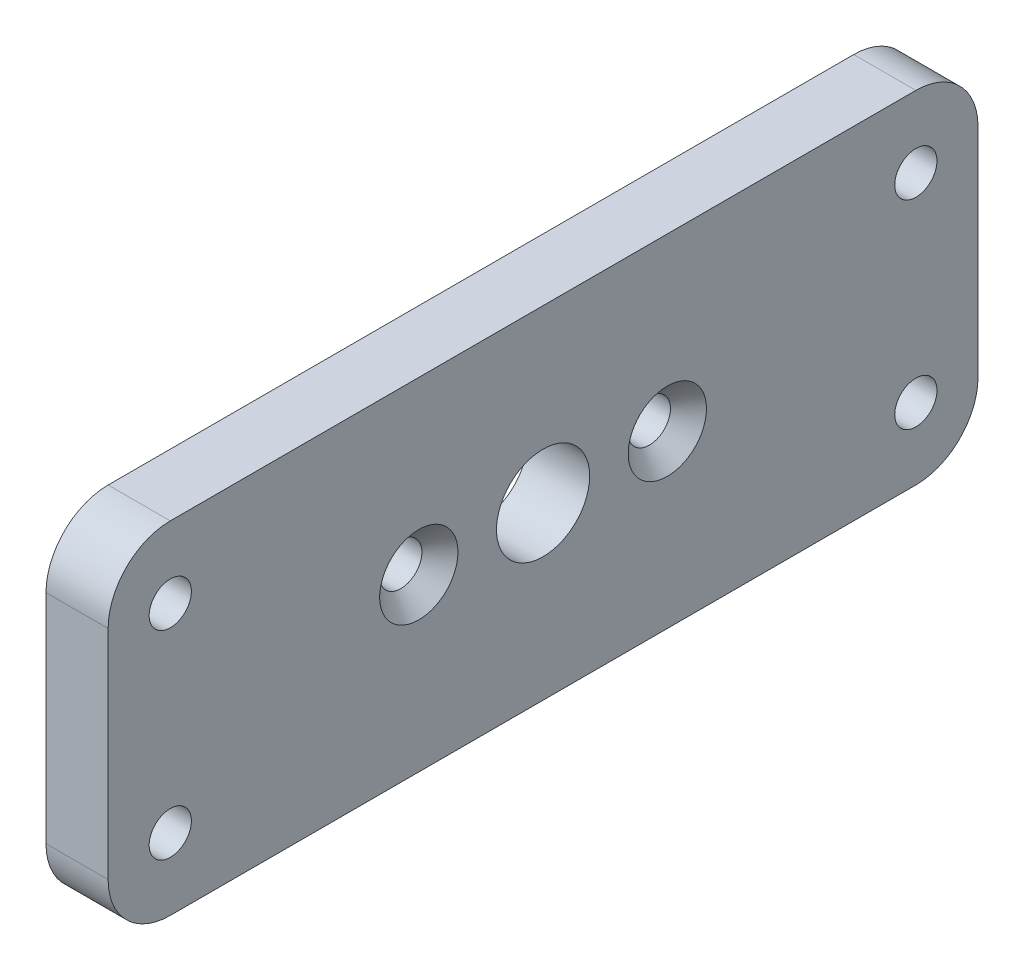
ISO-10303-21;
HEADER;
FILE_DESCRIPTION(('STEP AP214'),'2;1');
FILE_NAME('part.step','',(''),(''),'','','');
FILE_SCHEMA(('AUTOMOTIVE_DESIGN { 1 0 10303 214 1 1 1 1 }'));
ENDSEC;
DATA;
#1=APPLICATION_CONTEXT('core data for automotive mechanical design processes');
#2=APPLICATION_PROTOCOL_DEFINITION('international standard','automotive_design',2000,#1);
#3=PRODUCT_CONTEXT('',#1,'mechanical');
#4=PRODUCT('Part','Part','',(#3));
#5=PRODUCT_RELATED_PRODUCT_CATEGORY('part','',(#4));
#6=PRODUCT_DEFINITION_FORMATION('','',#4);
#7=PRODUCT_DEFINITION_CONTEXT('part definition',#1,'design');
#8=PRODUCT_DEFINITION('design','',#6,#7);
#9=PRODUCT_DEFINITION_SHAPE('','',#8);
#10=(LENGTH_UNIT() NAMED_UNIT(*) SI_UNIT(.MILLI.,.METRE.));
#11=(NAMED_UNIT(*) PLANE_ANGLE_UNIT() SI_UNIT($,.RADIAN.));
#12=(NAMED_UNIT(*) SI_UNIT($,.STERADIAN.) SOLID_ANGLE_UNIT());
#13=UNCERTAINTY_MEASURE_WITH_UNIT(LENGTH_MEASURE(1.E-05),#10,'distance_accuracy_value','');
#14=(GEOMETRIC_REPRESENTATION_CONTEXT(3) GLOBAL_UNCERTAINTY_ASSIGNED_CONTEXT((#13)) GLOBAL_UNIT_ASSIGNED_CONTEXT((#10,
#11,#12)) REPRESENTATION_CONTEXT('',''));
#15=CARTESIAN_POINT('',(0.,0.,0.));
#16=DIRECTION('',(0.,0.,1.));
#17=DIRECTION('',(1.,0.,0.));
#18=AXIS2_PLACEMENT_3D('',#15,#16,#17);
#19=CARTESIAN_POINT('',(5.,8.75,30.));
#20=DIRECTION('',(-1.,0.,0.));
#21=DIRECTION('',(0.,0.,1.));
#22=AXIS2_PLACEMENT_3D('',#19,#20,#21);
#23=PLANE('',#22);
#24=CARTESIAN_POINT('',(5.,8.,30.));
#25=DIRECTION('',(-1.,0.,0.));
#26=DIRECTION('',(0.,0.,1.));
#27=AXIS2_PLACEMENT_3D('',#24,#25,#26);
#28=CIRCLE('',#27,1.69999999999999);
#29=CARTESIAN_POINT('',(5.,8.,31.7));
#30=VERTEX_POINT('',#29);
#31=EDGE_CURVE('E264',#30,#30,#28,.T.);
#32=ORIENTED_EDGE('',*,*,#31,.T.);
#33=EDGE_LOOP('',(#32));
#34=FACE_BOUND('',#33,.T.);
#35=CARTESIAN_POINT('',(5.,-8.,30.));
#36=DIRECTION('',(-1.,0.,0.));
#37=DIRECTION('',(0.,0.,1.));
#38=AXIS2_PLACEMENT_3D('',#35,#36,#37);
#39=CIRCLE('',#38,1.69999999999999);
#40=CARTESIAN_POINT('',(5.,-8.,31.7));
#41=VERTEX_POINT('',#40);
#42=EDGE_CURVE('E256',#41,#41,#39,.T.);
#43=ORIENTED_EDGE('',*,*,#42,.T.);
#44=EDGE_LOOP('',(#43));
#45=FACE_BOUND('',#44,.T.);
#46=CARTESIAN_POINT('',(5.,-8.,-30.));
#47=DIRECTION('',(-1.,0.,0.));
#48=DIRECTION('',(0.,0.,1.));
#49=AXIS2_PLACEMENT_3D('',#46,#47,#48);
#50=CIRCLE('',#49,1.69999999999999);
#51=CARTESIAN_POINT('',(5.,-8.,-28.3));
#52=VERTEX_POINT('',#51);
#53=EDGE_CURVE('E248',#52,#52,#50,.T.);
#54=ORIENTED_EDGE('',*,*,#53,.T.);
#55=EDGE_LOOP('',(#54));
#56=FACE_BOUND('',#55,.T.);
#57=CARTESIAN_POINT('',(5.,8.,-30.));
#58=DIRECTION('',(-1.,0.,0.));
#59=DIRECTION('',(0.,0.,1.));
#60=AXIS2_PLACEMENT_3D('',#57,#58,#59);
#61=CIRCLE('',#60,1.69999999999999);
#62=CARTESIAN_POINT('',(5.,8.,-28.3));
#63=VERTEX_POINT('',#62);
#64=EDGE_CURVE('E240',#63,#63,#61,.T.);
#65=ORIENTED_EDGE('',*,*,#64,.T.);
#66=EDGE_LOOP('',(#65));
#67=FACE_BOUND('',#66,.T.);
#68=CARTESIAN_POINT('',(5.,0.,10.));
#69=DIRECTION('',(1.,0.,0.));
#70=DIRECTION('',(0.,0.,-1.));
#71=AXIS2_PLACEMENT_3D('',#68,#69,#70);
#72=CIRCLE('',#71,3.15);
#73=CARTESIAN_POINT('',(5.,0.,6.85));
#74=VERTEX_POINT('',#73);
#75=EDGE_CURVE('E236',#74,#74,#72,.T.);
#76=ORIENTED_EDGE('',*,*,#75,.F.);
#77=EDGE_LOOP('',(#76));
#78=FACE_BOUND('',#77,.T.);
#79=CARTESIAN_POINT('',(5.,0.,-10.));
#80=DIRECTION('',(1.,0.,0.));
#81=DIRECTION('',(0.,0.,-1.));
#82=AXIS2_PLACEMENT_3D('',#79,#80,#81);
#83=CIRCLE('',#82,3.15);
#84=CARTESIAN_POINT('',(5.,0.,-13.15));
#85=VERTEX_POINT('',#84);
#86=EDGE_CURVE('E224',#85,#85,#83,.T.);
#87=ORIENTED_EDGE('',*,*,#86,.F.);
#88=EDGE_LOOP('',(#87));
#89=FACE_BOUND('',#88,.T.);
#90=CARTESIAN_POINT('',(5.,8.75,30.));
#91=DIRECTION('',(1.,0.,0.));
#92=DIRECTION('',(0.,0.,1.));
#93=AXIS2_PLACEMENT_3D('',#90,#91,#92);
#94=CIRCLE('',#93,5.);
#95=CARTESIAN_POINT('',(5.,13.75,30.));
#96=VERTEX_POINT('',#95);
#97=CARTESIAN_POINT('',(5.,8.75,35.));
#98=VERTEX_POINT('',#97);
#99=EDGE_CURVE('E164',#96,#98,#94,.T.);
#100=ORIENTED_EDGE('',*,*,#99,.T.);
#101=DIRECTION('',(0.,-1.,0.));
#102=VECTOR('',#101,1.);
#103=CARTESIAN_POINT('',(5.,-8.75,35.));
#104=LINE('',#103,#102);
#105=CARTESIAN_POINT('',(5.,-8.75,35.));
#106=VERTEX_POINT('',#105);
#107=EDGE_CURVE('E100',#98,#106,#104,.T.);
#108=ORIENTED_EDGE('',*,*,#107,.T.);
#109=CARTESIAN_POINT('',(5.,-8.75,30.));
#110=DIRECTION('',(1.,0.,0.));
#111=DIRECTION('',(0.,0.,-1.));
#112=AXIS2_PLACEMENT_3D('',#109,#110,#111);
#113=CIRCLE('',#112,5.);
#114=CARTESIAN_POINT('',(5.,-13.75,30.));
#115=VERTEX_POINT('',#114);
#116=EDGE_CURVE('E185',#106,#115,#113,.T.);
#117=ORIENTED_EDGE('',*,*,#116,.T.);
#118=DIRECTION('',(0.,0.,-1.));
#119=VECTOR('',#118,1.);
#120=CARTESIAN_POINT('',(5.,-13.75,30.));
#121=LINE('',#120,#119);
#122=CARTESIAN_POINT('',(5.,-13.75,-30.));
#123=VERTEX_POINT('',#122);
#124=EDGE_CURVE('E199',#115,#123,#121,.T.);
#125=ORIENTED_EDGE('',*,*,#124,.T.);
#126=CARTESIAN_POINT('',(5.,-8.75,-30.));
#127=DIRECTION('',(1.,0.,0.));
#128=DIRECTION('',(0.,0.,-1.));
#129=AXIS2_PLACEMENT_3D('',#126,#127,#128);
#130=CIRCLE('',#129,5.);
#131=CARTESIAN_POINT('',(5.,-8.75,-35.));
#132=VERTEX_POINT('',#131);
#133=EDGE_CURVE('E119',#123,#132,#130,.T.);
#134=ORIENTED_EDGE('',*,*,#133,.T.);
#135=DIRECTION('',(0.,1.,0.));
#136=VECTOR('',#135,1.);
#137=CARTESIAN_POINT('',(5.,-8.75,-35.));
#138=LINE('',#137,#136);
#139=CARTESIAN_POINT('',(5.,8.75,-35.));
#140=VERTEX_POINT('',#139);
#141=EDGE_CURVE('E113',#132,#140,#138,.T.);
#142=ORIENTED_EDGE('',*,*,#141,.T.);
#143=CARTESIAN_POINT('',(5.,8.75,-30.));
#144=DIRECTION('',(1.,0.,0.));
#145=DIRECTION('',(0.,0.,-1.));
#146=AXIS2_PLACEMENT_3D('',#143,#144,#145);
#147=CIRCLE('',#146,5.);
#148=CARTESIAN_POINT('',(5.,13.75,-30.));
#149=VERTEX_POINT('',#148);
#150=EDGE_CURVE('E117',#140,#149,#147,.T.);
#151=ORIENTED_EDGE('',*,*,#150,.T.);
#152=DIRECTION('',(0.,0.,1.));
#153=VECTOR('',#152,1.);
#154=CARTESIAN_POINT('',(5.,13.75,30.));
#155=LINE('',#154,#153);
#156=EDGE_CURVE('E57',#149,#96,#155,.T.);
#157=ORIENTED_EDGE('',*,*,#156,.T.);
#158=EDGE_LOOP('',(#100,#108,#117,#125,#134,#142,#151,#157));
#159=FACE_BOUND('',#158,.T.);
#160=CARTESIAN_POINT('',(5.,0.,0.));
#161=DIRECTION('',(1.,0.,0.));
#162=DIRECTION('',(0.,0.,-1.));
#163=AXIS2_PLACEMENT_3D('',#160,#161,#162);
#164=CIRCLE('',#163,3.75);
#165=CARTESIAN_POINT('',(5.,0.,-3.75000000000001));
#166=VERTEX_POINT('',#165);
#167=EDGE_CURVE('E146',#166,#166,#164,.T.);
#168=ORIENTED_EDGE('',*,*,#167,.F.);
#169=EDGE_LOOP('',(#168));
#170=FACE_BOUND('',#169,.T.);
#171=ADVANCED_FACE('F39',(#34,#45,#56,#67,#78,#89,#159,#170),#23,.F.);
#172=CARTESIAN_POINT('',(0.,8.75,30.));
#173=DIRECTION('',(-1.,0.,0.));
#174=DIRECTION('',(0.,0.,1.));
#175=AXIS2_PLACEMENT_3D('',#172,#173,#174);
#176=PLANE('',#175);
#177=CARTESIAN_POINT('',(0.,8.,30.));
#178=DIRECTION('',(-1.,0.,0.));
#179=DIRECTION('',(0.,0.,1.));
#180=AXIS2_PLACEMENT_3D('',#177,#178,#179);
#181=CIRCLE('',#180,1.69999999999999);
#182=CARTESIAN_POINT('',(0.,8.,31.7));
#183=VERTEX_POINT('',#182);
#184=EDGE_CURVE('E268',#183,#183,#181,.T.);
#185=ORIENTED_EDGE('',*,*,#184,.F.);
#186=EDGE_LOOP('',(#185));
#187=FACE_BOUND('',#186,.T.);
#188=CARTESIAN_POINT('',(0.,-8.,30.));
#189=DIRECTION('',(-1.,0.,0.));
#190=DIRECTION('',(0.,0.,1.));
#191=AXIS2_PLACEMENT_3D('',#188,#189,#190);
#192=CIRCLE('',#191,1.69999999999999);
#193=CARTESIAN_POINT('',(0.,-8.,31.7));
#194=VERTEX_POINT('',#193);
#195=EDGE_CURVE('E260',#194,#194,#192,.T.);
#196=ORIENTED_EDGE('',*,*,#195,.F.);
#197=EDGE_LOOP('',(#196));
#198=FACE_BOUND('',#197,.T.);
#199=CARTESIAN_POINT('',(0.,-8.,-30.));
#200=DIRECTION('',(-1.,0.,0.));
#201=DIRECTION('',(0.,0.,1.));
#202=AXIS2_PLACEMENT_3D('',#199,#200,#201);
#203=CIRCLE('',#202,1.69999999999999);
#204=CARTESIAN_POINT('',(0.,-8.,-28.3));
#205=VERTEX_POINT('',#204);
#206=EDGE_CURVE('E252',#205,#205,#203,.T.);
#207=ORIENTED_EDGE('',*,*,#206,.F.);
#208=EDGE_LOOP('',(#207));
#209=FACE_BOUND('',#208,.T.);
#210=CARTESIAN_POINT('',(0.,8.,-30.));
#211=DIRECTION('',(-1.,0.,0.));
#212=DIRECTION('',(0.,0.,1.));
#213=AXIS2_PLACEMENT_3D('',#210,#211,#212);
#214=CIRCLE('',#213,1.69999999999999);
#215=CARTESIAN_POINT('',(0.,8.,-28.3));
#216=VERTEX_POINT('',#215);
#217=EDGE_CURVE('E244',#216,#216,#214,.T.);
#218=ORIENTED_EDGE('',*,*,#217,.F.);
#219=EDGE_LOOP('',(#218));
#220=FACE_BOUND('',#219,.T.);
#221=CARTESIAN_POINT('',(0.,0.,10.));
#222=DIRECTION('',(1.,0.,0.));
#223=DIRECTION('',(0.,0.,-1.));
#224=AXIS2_PLACEMENT_3D('',#221,#222,#223);
#225=CIRCLE('',#224,1.69999999999999);
#226=CARTESIAN_POINT('',(0.,0.,8.30000000000001));
#227=VERTEX_POINT('',#226);
#228=EDGE_CURVE('E228',#227,#227,#225,.T.);
#229=ORIENTED_EDGE('',*,*,#228,.T.);
#230=EDGE_LOOP('',(#229));
#231=FACE_BOUND('',#230,.T.);
#232=CARTESIAN_POINT('',(0.,0.,-10.));
#233=DIRECTION('',(1.,0.,0.));
#234=DIRECTION('',(0.,0.,-1.));
#235=AXIS2_PLACEMENT_3D('',#232,#233,#234);
#236=CIRCLE('',#235,1.69999999999999);
#237=CARTESIAN_POINT('',(0.,0.,-11.7));
#238=VERTEX_POINT('',#237);
#239=EDGE_CURVE('E213',#238,#238,#236,.T.);
#240=ORIENTED_EDGE('',*,*,#239,.T.);
#241=EDGE_LOOP('',(#240));
#242=FACE_BOUND('',#241,.T.);
#243=CARTESIAN_POINT('',(0.,8.75,30.));
#244=DIRECTION('',(1.,0.,0.));
#245=DIRECTION('',(0.,0.,1.));
#246=AXIS2_PLACEMENT_3D('',#243,#244,#245);
#247=CIRCLE('',#246,5.);
#248=CARTESIAN_POINT('',(0.,13.75,30.));
#249=VERTEX_POINT('',#248);
#250=CARTESIAN_POINT('',(0.,8.75,35.));
#251=VERTEX_POINT('',#250);
#252=EDGE_CURVE('E141',#249,#251,#247,.T.);
#253=ORIENTED_EDGE('',*,*,#252,.F.);
#254=DIRECTION('',(0.,0.,1.));
#255=VECTOR('',#254,1.);
#256=CARTESIAN_POINT('',(0.,13.75,30.));
#257=LINE('',#256,#255);
#258=CARTESIAN_POINT('',(0.,13.75,-30.));
#259=VERTEX_POINT('',#258);
#260=EDGE_CURVE('E92',#259,#249,#257,.T.);
#261=ORIENTED_EDGE('',*,*,#260,.F.);
#262=CARTESIAN_POINT('',(0.,8.75,-30.));
#263=DIRECTION('',(1.,0.,0.));
#264=DIRECTION('',(0.,0.,-1.));
#265=AXIS2_PLACEMENT_3D('',#262,#263,#264);
#266=CIRCLE('',#265,5.);
#267=CARTESIAN_POINT('',(0.,8.75,-35.));
#268=VERTEX_POINT('',#267);
#269=EDGE_CURVE('E86',#268,#259,#266,.T.);
#270=ORIENTED_EDGE('',*,*,#269,.F.);
#271=DIRECTION('',(0.,1.,0.));
#272=VECTOR('',#271,1.);
#273=CARTESIAN_POINT('',(0.,-8.75,-35.));
#274=LINE('',#273,#272);
#275=CARTESIAN_POINT('',(0.,-8.75,-35.));
#276=VERTEX_POINT('',#275);
#277=EDGE_CURVE('E128',#276,#268,#274,.T.);
#278=ORIENTED_EDGE('',*,*,#277,.F.);
#279=CARTESIAN_POINT('',(0.,-8.75,-30.));
#280=DIRECTION('',(1.,0.,0.));
#281=DIRECTION('',(0.,0.,-1.));
#282=AXIS2_PLACEMENT_3D('',#279,#280,#281);
#283=CIRCLE('',#282,5.);
#284=CARTESIAN_POINT('',(0.,-13.75,-30.));
#285=VERTEX_POINT('',#284);
#286=EDGE_CURVE('E155',#285,#276,#283,.T.);
#287=ORIENTED_EDGE('',*,*,#286,.F.);
#288=DIRECTION('',(0.,0.,-1.));
#289=VECTOR('',#288,1.);
#290=CARTESIAN_POINT('',(0.,-13.75,30.));
#291=LINE('',#290,#289);
#292=CARTESIAN_POINT('',(0.,-13.75,30.));
#293=VERTEX_POINT('',#292);
#294=EDGE_CURVE('E152',#293,#285,#291,.T.);
#295=ORIENTED_EDGE('',*,*,#294,.F.);
#296=CARTESIAN_POINT('',(0.,-8.75,30.));
#297=DIRECTION('',(1.,0.,0.));
#298=DIRECTION('',(0.,0.,-1.));
#299=AXIS2_PLACEMENT_3D('',#296,#297,#298);
#300=CIRCLE('',#299,5.);
#301=CARTESIAN_POINT('',(0.,-8.75,35.));
#302=VERTEX_POINT('',#301);
#303=EDGE_CURVE('E149',#302,#293,#300,.T.);
#304=ORIENTED_EDGE('',*,*,#303,.F.);
#305=DIRECTION('',(0.,-1.,0.));
#306=VECTOR('',#305,1.);
#307=CARTESIAN_POINT('',(0.,-8.75,35.));
#308=LINE('',#307,#306);
#309=EDGE_CURVE('E145',#251,#302,#308,.T.);
#310=ORIENTED_EDGE('',*,*,#309,.F.);
#311=EDGE_LOOP('',(#253,#261,#270,#278,#287,#295,#304,#310));
#312=FACE_BOUND('',#311,.T.);
#313=CARTESIAN_POINT('',(0.,0.,0.));
#314=DIRECTION('',(1.,0.,0.));
#315=DIRECTION('',(0.,0.,-1.));
#316=AXIS2_PLACEMENT_3D('',#313,#314,#315);
#317=CIRCLE('',#316,3.75);
#318=CARTESIAN_POINT('',(0.,0.,-3.75000000000001));
#319=VERTEX_POINT('',#318);
#320=EDGE_CURVE('E209',#319,#319,#317,.T.);
#321=ORIENTED_EDGE('',*,*,#320,.T.);
#322=EDGE_LOOP('',(#321));
#323=FACE_BOUND('',#322,.T.);
#324=ADVANCED_FACE('F189',(#187,#198,#209,#220,#231,#242,#312,#323),#176,.T.);
#325=CARTESIAN_POINT('',(5.,8.75,30.));
#326=DIRECTION('',(-1.,0.,0.));
#327=DIRECTION('',(0.,0.,1.));
#328=AXIS2_PLACEMENT_3D('',#325,#326,#327);
#329=CYLINDRICAL_SURFACE('',#328,5.);
#330=ORIENTED_EDGE('',*,*,#252,.T.);
#331=DIRECTION('',(-1.,0.,0.));
#332=VECTOR('',#331,1.);
#333=CARTESIAN_POINT('',(5.,8.75,35.));
#334=LINE('',#333,#332);
#335=EDGE_CURVE('E11',#98,#251,#334,.T.);
#336=ORIENTED_EDGE('',*,*,#335,.F.);
#337=ORIENTED_EDGE('',*,*,#99,.F.);
#338=DIRECTION('',(-1.,0.,0.));
#339=VECTOR('',#338,1.);
#340=CARTESIAN_POINT('',(5.,13.75,30.));
#341=LINE('',#340,#339);
#342=EDGE_CURVE('E137',#96,#249,#341,.T.);
#343=ORIENTED_EDGE('',*,*,#342,.T.);
#344=EDGE_LOOP('',(#330,#336,#337,#343));
#345=FACE_BOUND('',#344,.T.);
#346=ADVANCED_FACE('F41',(#345),#329,.T.);
#347=CARTESIAN_POINT('',(5.,-8.75,35.));
#348=DIRECTION('',(0.,0.,-1.));
#349=DIRECTION('',(-1.,0.,0.));
#350=AXIS2_PLACEMENT_3D('',#347,#348,#349);
#351=PLANE('',#350);
#352=ORIENTED_EDGE('',*,*,#309,.T.);
#353=DIRECTION('',(-1.,0.,0.));
#354=VECTOR('',#353,1.);
#355=CARTESIAN_POINT('',(5.,-8.75,35.));
#356=LINE('',#355,#354);
#357=EDGE_CURVE('E49',#106,#302,#356,.T.);
#358=ORIENTED_EDGE('',*,*,#357,.F.);
#359=ORIENTED_EDGE('',*,*,#107,.F.);
#360=ORIENTED_EDGE('',*,*,#335,.T.);
#361=EDGE_LOOP('',(#352,#358,#359,#360));
#362=FACE_BOUND('',#361,.T.);
#363=ADVANCED_FACE('F322',(#362),#351,.F.);
#364=CARTESIAN_POINT('',(5.,-8.75,30.));
#365=DIRECTION('',(-1.,0.,0.));
#366=DIRECTION('',(0.,0.,1.));
#367=AXIS2_PLACEMENT_3D('',#364,#365,#366);
#368=CYLINDRICAL_SURFACE('',#367,5.);
#369=ORIENTED_EDGE('',*,*,#303,.T.);
#370=DIRECTION('',(-1.,0.,0.));
#371=VECTOR('',#370,1.);
#372=CARTESIAN_POINT('',(5.,-13.75,30.));
#373=LINE('',#372,#371);
#374=EDGE_CURVE('E175',#115,#293,#373,.T.);
#375=ORIENTED_EDGE('',*,*,#374,.F.);
#376=ORIENTED_EDGE('',*,*,#116,.F.);
#377=ORIENTED_EDGE('',*,*,#357,.T.);
#378=EDGE_LOOP('',(#369,#375,#376,#377));
#379=FACE_BOUND('',#378,.T.);
#380=ADVANCED_FACE('F183',(#379),#368,.T.);
#381=CARTESIAN_POINT('',(5.,-13.75,30.));
#382=DIRECTION('',(0.,1.,0.));
#383=DIRECTION('',(0.,0.,1.));
#384=AXIS2_PLACEMENT_3D('',#381,#382,#383);
#385=PLANE('',#384);
#386=ORIENTED_EDGE('',*,*,#294,.T.);
#387=DIRECTION('',(-1.,0.,0.));
#388=VECTOR('',#387,1.);
#389=CARTESIAN_POINT('',(5.,-13.75,-30.));
#390=LINE('',#389,#388);
#391=EDGE_CURVE('E171',#123,#285,#390,.T.);
#392=ORIENTED_EDGE('',*,*,#391,.F.);
#393=ORIENTED_EDGE('',*,*,#124,.F.);
#394=ORIENTED_EDGE('',*,*,#374,.T.);
#395=EDGE_LOOP('',(#386,#392,#393,#394));
#396=FACE_BOUND('',#395,.T.);
#397=ADVANCED_FACE('F194',(#396),#385,.F.);
#398=CARTESIAN_POINT('',(5.,-8.75,-30.));
#399=DIRECTION('',(-1.,0.,0.));
#400=DIRECTION('',(0.,0.,1.));
#401=AXIS2_PLACEMENT_3D('',#398,#399,#400);
#402=CYLINDRICAL_SURFACE('',#401,5.);
#403=ORIENTED_EDGE('',*,*,#286,.T.);
#404=DIRECTION('',(-1.,0.,0.));
#405=VECTOR('',#404,1.);
#406=CARTESIAN_POINT('',(5.,-8.75,-35.));
#407=LINE('',#406,#405);
#408=EDGE_CURVE('E130',#132,#276,#407,.T.);
#409=ORIENTED_EDGE('',*,*,#408,.F.);
#410=ORIENTED_EDGE('',*,*,#133,.F.);
#411=ORIENTED_EDGE('',*,*,#391,.T.);
#412=EDGE_LOOP('',(#403,#409,#410,#411));
#413=FACE_BOUND('',#412,.T.);
#414=ADVANCED_FACE('F197',(#413),#402,.T.);
#415=CARTESIAN_POINT('',(5.,-8.75,-35.));
#416=DIRECTION('',(0.,0.,1.));
#417=DIRECTION('',(0.,-1.,0.));
#418=AXIS2_PLACEMENT_3D('',#415,#416,#417);
#419=PLANE('',#418);
#420=ORIENTED_EDGE('',*,*,#277,.T.);
#421=DIRECTION('',(-1.,0.,0.));
#422=VECTOR('',#421,1.);
#423=CARTESIAN_POINT('',(5.,8.75,-35.));
#424=LINE('',#423,#422);
#425=EDGE_CURVE('E125',#140,#268,#424,.T.);
#426=ORIENTED_EDGE('',*,*,#425,.F.);
#427=ORIENTED_EDGE('',*,*,#141,.F.);
#428=ORIENTED_EDGE('',*,*,#408,.T.);
#429=EDGE_LOOP('',(#420,#426,#427,#428));
#430=FACE_BOUND('',#429,.T.);
#431=ADVANCED_FACE('F126',(#430),#419,.F.);
#432=CARTESIAN_POINT('',(5.,8.75,-30.));
#433=DIRECTION('',(-1.,0.,0.));
#434=DIRECTION('',(0.,0.,1.));
#435=AXIS2_PLACEMENT_3D('',#432,#433,#434);
#436=CYLINDRICAL_SURFACE('',#435,5.);
#437=ORIENTED_EDGE('',*,*,#269,.T.);
#438=DIRECTION('',(-1.,0.,0.));
#439=VECTOR('',#438,1.);
#440=CARTESIAN_POINT('',(5.,13.75,-30.));
#441=LINE('',#440,#439);
#442=EDGE_CURVE('E131',#149,#259,#441,.T.);
#443=ORIENTED_EDGE('',*,*,#442,.F.);
#444=ORIENTED_EDGE('',*,*,#150,.F.);
#445=ORIENTED_EDGE('',*,*,#425,.T.);
#446=EDGE_LOOP('',(#437,#443,#444,#445));
#447=FACE_BOUND('',#446,.T.);
#448=ADVANCED_FACE('F133',(#447),#436,.T.);
#449=CARTESIAN_POINT('',(5.,13.75,30.));
#450=DIRECTION('',(0.,-1.,0.));
#451=DIRECTION('',(0.,0.,-1.));
#452=AXIS2_PLACEMENT_3D('',#449,#450,#451);
#453=PLANE('',#452);
#454=ORIENTED_EDGE('',*,*,#260,.T.);
#455=ORIENTED_EDGE('',*,*,#342,.F.);
#456=ORIENTED_EDGE('',*,*,#156,.F.);
#457=ORIENTED_EDGE('',*,*,#442,.T.);
#458=EDGE_LOOP('',(#454,#455,#456,#457));
#459=FACE_BOUND('',#458,.T.);
#460=ADVANCED_FACE('F310',(#459),#453,.F.);
#461=CARTESIAN_POINT('',(5.,0.,0.));
#462=DIRECTION('',(-1.,0.,0.));
#463=DIRECTION('',(0.,0.,1.));
#464=AXIS2_PLACEMENT_3D('',#461,#462,#463);
#465=CYLINDRICAL_SURFACE('',#464,3.75);
#466=ORIENTED_EDGE('',*,*,#167,.T.);
#467=EDGE_LOOP('',(#466));
#468=FACE_BOUND('',#467,.T.);
#469=ORIENTED_EDGE('',*,*,#320,.F.);
#470=EDGE_LOOP('',(#469));
#471=FACE_BOUND('',#470,.T.);
#472=ADVANCED_FACE('F292',(#468,#471),#465,.F.);
#473=CARTESIAN_POINT('',(5.,0.,-10.));
#474=DIRECTION('',(1.,0.,0.));
#475=DIRECTION('',(0.,0.,-1.));
#476=AXIS2_PLACEMENT_3D('',#473,#474,#475);
#477=CYLINDRICAL_SURFACE('',#476,1.69999999999999);
#478=ORIENTED_EDGE('',*,*,#239,.F.);
#479=EDGE_LOOP('',(#478));
#480=FACE_BOUND('',#479,.T.);
#481=CARTESIAN_POINT('',(3.55,0.,-10.));
#482=DIRECTION('',(1.,0.,0.));
#483=DIRECTION('',(0.,0.,-1.));
#484=AXIS2_PLACEMENT_3D('',#481,#482,#483);
#485=CIRCLE('',#484,1.7);
#486=CARTESIAN_POINT('',(3.55,0.,-11.7));
#487=VERTEX_POINT('',#486);
#488=EDGE_CURVE('E220',#487,#487,#485,.T.);
#489=ORIENTED_EDGE('',*,*,#488,.T.);
#490=EDGE_LOOP('',(#489));
#491=FACE_BOUND('',#490,.T.);
#492=ADVANCED_FACE('F288',(#480,#491),#477,.F.);
#493=CARTESIAN_POINT('',(5.,0.,-10.));
#494=DIRECTION('',(1.,0.,0.));
#495=DIRECTION('',(0.,0.,-1.));
#496=AXIS2_PLACEMENT_3D('',#493,#494,#495);
#497=CONICAL_SURFACE('',#496,3.15,0.785398163397449);
#498=ORIENTED_EDGE('',*,*,#488,.F.);
#499=EDGE_LOOP('',(#498));
#500=FACE_BOUND('',#499,.T.);
#501=ORIENTED_EDGE('',*,*,#86,.T.);
#502=EDGE_LOOP('',(#501));
#503=FACE_BOUND('',#502,.T.);
#504=ADVANCED_FACE('F291',(#500,#503),#497,.F.);
#505=CARTESIAN_POINT('',(5.,0.,10.));
#506=DIRECTION('',(1.,0.,0.));
#507=DIRECTION('',(0.,0.,-1.));
#508=AXIS2_PLACEMENT_3D('',#505,#506,#507);
#509=CYLINDRICAL_SURFACE('',#508,1.69999999999999);
#510=ORIENTED_EDGE('',*,*,#228,.F.);
#511=EDGE_LOOP('',(#510));
#512=FACE_BOUND('',#511,.T.);
#513=CARTESIAN_POINT('',(3.55,0.,10.));
#514=DIRECTION('',(1.,0.,0.));
#515=DIRECTION('',(0.,0.,-1.));
#516=AXIS2_PLACEMENT_3D('',#513,#514,#515);
#517=CIRCLE('',#516,1.7);
#518=CARTESIAN_POINT('',(3.55,0.,8.3));
#519=VERTEX_POINT('',#518);
#520=EDGE_CURVE('E232',#519,#519,#517,.T.);
#521=ORIENTED_EDGE('',*,*,#520,.T.);
#522=EDGE_LOOP('',(#521));
#523=FACE_BOUND('',#522,.T.);
#524=ADVANCED_FACE('F298',(#512,#523),#509,.F.);
#525=CARTESIAN_POINT('',(5.,0.,10.));
#526=DIRECTION('',(1.,0.,0.));
#527=DIRECTION('',(0.,0.,-1.));
#528=AXIS2_PLACEMENT_3D('',#525,#526,#527);
#529=CONICAL_SURFACE('',#528,3.15,0.785398163397449);
#530=ORIENTED_EDGE('',*,*,#520,.F.);
#531=EDGE_LOOP('',(#530));
#532=FACE_BOUND('',#531,.T.);
#533=ORIENTED_EDGE('',*,*,#75,.T.);
#534=EDGE_LOOP('',(#533));
#535=FACE_BOUND('',#534,.T.);
#536=ADVANCED_FACE('F350',(#532,#535),#529,.F.);
#537=CARTESIAN_POINT('',(0.,8.,-30.));
#538=DIRECTION('',(-1.,0.,0.));
#539=DIRECTION('',(0.,0.,1.));
#540=AXIS2_PLACEMENT_3D('',#537,#538,#539);
#541=CYLINDRICAL_SURFACE('',#540,1.69999999999999);
#542=ORIENTED_EDGE('',*,*,#64,.F.);
#543=EDGE_LOOP('',(#542));
#544=FACE_BOUND('',#543,.T.);
#545=ORIENTED_EDGE('',*,*,#217,.T.);
#546=EDGE_LOOP('',(#545));
#547=FACE_BOUND('',#546,.T.);
#548=ADVANCED_FACE('F344',(#544,#547),#541,.F.);
#549=CARTESIAN_POINT('',(0.,-8.,-30.));
#550=DIRECTION('',(-1.,0.,0.));
#551=DIRECTION('',(0.,0.,1.));
#552=AXIS2_PLACEMENT_3D('',#549,#550,#551);
#553=CYLINDRICAL_SURFACE('',#552,1.69999999999999);
#554=ORIENTED_EDGE('',*,*,#53,.F.);
#555=EDGE_LOOP('',(#554));
#556=FACE_BOUND('',#555,.T.);
#557=ORIENTED_EDGE('',*,*,#206,.T.);
#558=EDGE_LOOP('',(#557));
#559=FACE_BOUND('',#558,.T.);
#560=ADVANCED_FACE('F349',(#556,#559),#553,.F.);
#561=CARTESIAN_POINT('',(0.,-8.,30.));
#562=DIRECTION('',(-1.,0.,0.));
#563=DIRECTION('',(0.,0.,1.));
#564=AXIS2_PLACEMENT_3D('',#561,#562,#563);
#565=CYLINDRICAL_SURFACE('',#564,1.69999999999999);
#566=ORIENTED_EDGE('',*,*,#42,.F.);
#567=EDGE_LOOP('',(#566));
#568=FACE_BOUND('',#567,.T.);
#569=ORIENTED_EDGE('',*,*,#195,.T.);
#570=EDGE_LOOP('',(#569));
#571=FACE_BOUND('',#570,.T.);
#572=ADVANCED_FACE('F362',(#568,#571),#565,.F.);
#573=CARTESIAN_POINT('',(0.,8.,30.));
#574=DIRECTION('',(-1.,0.,0.));
#575=DIRECTION('',(0.,0.,1.));
#576=AXIS2_PLACEMENT_3D('',#573,#574,#575);
#577=CYLINDRICAL_SURFACE('',#576,1.69999999999999);
#578=ORIENTED_EDGE('',*,*,#31,.F.);
#579=EDGE_LOOP('',(#578));
#580=FACE_BOUND('',#579,.T.);
#581=ORIENTED_EDGE('',*,*,#184,.T.);
#582=EDGE_LOOP('',(#581));
#583=FACE_BOUND('',#582,.T.);
#584=ADVANCED_FACE('F273',(#580,#583),#577,.F.);
#585=CLOSED_SHELL('',(#171,#324,#346,#363,#380,#397,#414,#431,#448,#460,#472,#492,#504,#524,
#536,#548,#560,#572,#584));
#586=MANIFOLD_SOLID_BREP('B2',#585);
#587=ADVANCED_BREP_SHAPE_REPRESENTATION('',(#18,#586),#14);
#588=SHAPE_DEFINITION_REPRESENTATION(#9,#587);
ENDSEC;
END-ISO-10303-21;
